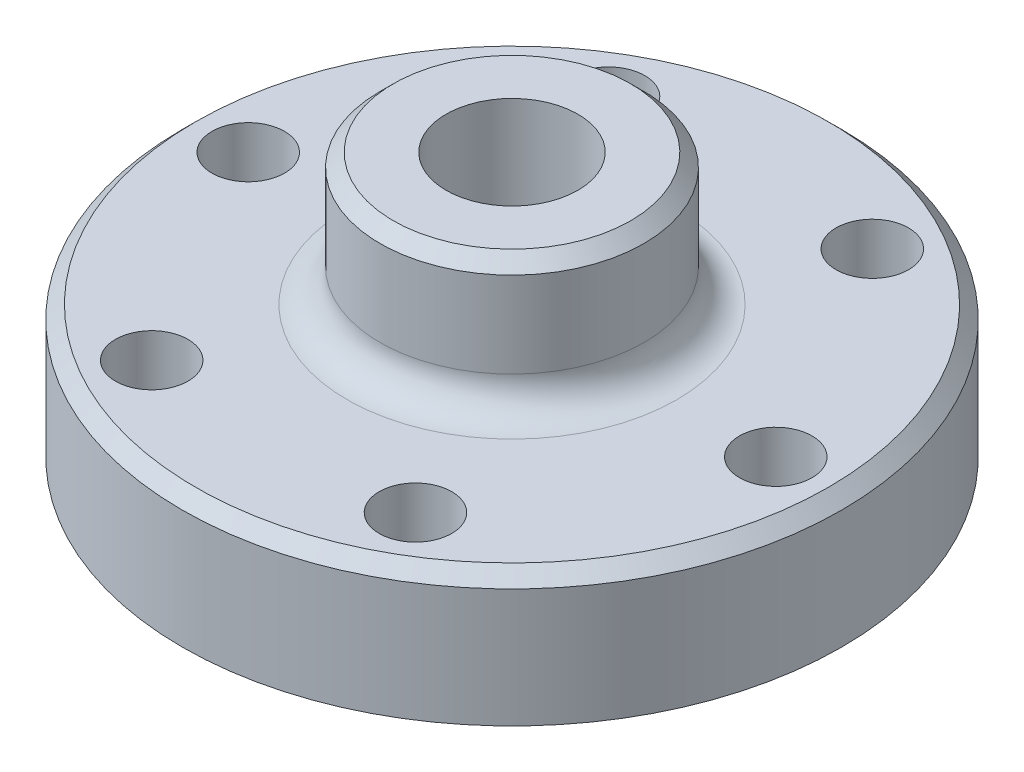
ISO-10303-21;
HEADER;
FILE_DESCRIPTION(('STEP AP214'),'2;1');
FILE_NAME('part.step','',(''),(''),'','','');
FILE_SCHEMA(('AUTOMOTIVE_DESIGN { 1 0 10303 214 1 1 1 1 }'));
ENDSEC;
DATA;
#1=APPLICATION_CONTEXT('core data for automotive mechanical design processes');
#2=APPLICATION_PROTOCOL_DEFINITION('international standard','automotive_design',2000,#1);
#3=PRODUCT_CONTEXT('',#1,'mechanical');
#4=PRODUCT('Part','Part','',(#3));
#5=PRODUCT_RELATED_PRODUCT_CATEGORY('part','',(#4));
#6=PRODUCT_DEFINITION_FORMATION('','',#4);
#7=PRODUCT_DEFINITION_CONTEXT('part definition',#1,'design');
#8=PRODUCT_DEFINITION('design','',#6,#7);
#9=PRODUCT_DEFINITION_SHAPE('','',#8);
#10=(LENGTH_UNIT() NAMED_UNIT(*) SI_UNIT(.MILLI.,.METRE.));
#11=(NAMED_UNIT(*) PLANE_ANGLE_UNIT() SI_UNIT($,.RADIAN.));
#12=(NAMED_UNIT(*) SI_UNIT($,.STERADIAN.) SOLID_ANGLE_UNIT());
#13=UNCERTAINTY_MEASURE_WITH_UNIT(LENGTH_MEASURE(1.E-05),#10,'distance_accuracy_value','');
#14=(GEOMETRIC_REPRESENTATION_CONTEXT(3) GLOBAL_UNCERTAINTY_ASSIGNED_CONTEXT((#13)) GLOBAL_UNIT_ASSIGNED_CONTEXT((#10,
#11,#12)) REPRESENTATION_CONTEXT('',''));
#15=CARTESIAN_POINT('',(0.,0.,0.));
#16=DIRECTION('',(0.,0.,1.));
#17=DIRECTION('',(1.,0.,0.));
#18=AXIS2_PLACEMENT_3D('',#15,#16,#17);
#19=CARTESIAN_POINT('',(2.2007818080183E-12,-641.580774087587,0.));
#20=DIRECTION('',(0.,-1.,0.));
#21=DIRECTION('',(1.,0.,0.));
#22=AXIS2_PLACEMENT_3D('',#19,#20,#21);
#23=CYLINDRICAL_SURFACE('',#22,19.9999999999999);
#24=CARTESIAN_POINT('',(-1.38925084454874E-13,40.5000000000001,0.));
#25=DIRECTION('',(0.,-1.,0.));
#26=DIRECTION('',(1.,0.,0.));
#27=AXIS2_PLACEMENT_3D('',#24,#25,#26);
#28=CIRCLE('',#27,19.9999999999999);
#29=CARTESIAN_POINT('',(19.9999999999997,40.5000000000002,0.));
#30=VERTEX_POINT('',#29);
#31=EDGE_CURVE('E89',#30,#30,#28,.T.);
#32=ORIENTED_EDGE('',*,*,#31,.T.);
#33=EDGE_LOOP('',(#32));
#34=FACE_BOUND('',#33,.T.);
#35=CARTESIAN_POINT('',(0.,27.5000000000002,0.));
#36=DIRECTION('',(0.,-1.,0.));
#37=DIRECTION('',(1.,0.,0.));
#38=AXIS2_PLACEMENT_3D('',#35,#36,#37);
#39=CIRCLE('',#38,19.9999999999999);
#40=CARTESIAN_POINT('',(19.9999999999998,27.5000000000003,0.));
#41=VERTEX_POINT('',#40);
#42=EDGE_CURVE('E93',#41,#41,#39,.T.);
#43=ORIENTED_EDGE('',*,*,#42,.F.);
#44=EDGE_LOOP('',(#43));
#45=FACE_BOUND('',#44,.T.);
#46=ADVANCED_FACE('F45',(#34,#45),#23,.T.);
#47=CARTESIAN_POINT('',(0.,27.5000000000001,0.));
#48=DIRECTION('',(0.,-1.,0.));
#49=DIRECTION('',(1.,0.,0.));
#50=AXIS2_PLACEMENT_3D('',#47,#48,#49);
#51=TOROIDAL_SURFACE('',#50,24.9999999999999,5.);
#52=ORIENTED_EDGE('',*,*,#42,.T.);
#53=EDGE_LOOP('',(#52));
#54=FACE_BOUND('',#53,.T.);
#55=CARTESIAN_POINT('',(0.,22.5000000000001,0.));
#56=DIRECTION('',(0.,-1.,0.));
#57=DIRECTION('',(1.,0.,0.));
#58=AXIS2_PLACEMENT_3D('',#55,#56,#57);
#59=CIRCLE('',#58,25.);
#60=CARTESIAN_POINT('',(24.9999999999999,22.5000000000002,0.));
#61=VERTEX_POINT('',#60);
#62=EDGE_CURVE('E10',#61,#61,#59,.T.);
#63=ORIENTED_EDGE('',*,*,#62,.F.);
#64=EDGE_LOOP('',(#63));
#65=FACE_BOUND('',#64,.T.);
#66=ADVANCED_FACE('F47',(#54,#65),#51,.F.);
#67=CARTESIAN_POINT('',(-1.38925084454874E-13,40.5000000000001,0.));
#68=DIRECTION('',(0.,-1.,0.));
#69=DIRECTION('',(1.,0.,0.));
#70=AXIS2_PLACEMENT_3D('',#67,#68,#69);
#71=CONICAL_SURFACE('',#70,19.9999999999999,0.78539816339745);
#72=CARTESIAN_POINT('',(-1.45785582452645E-13,42.5000000000001,0.));
#73=DIRECTION('',(0.,-1.,0.));
#74=DIRECTION('',(1.,0.,0.));
#75=AXIS2_PLACEMENT_3D('',#72,#73,#74);
#76=CIRCLE('',#75,17.9999999999999);
#77=CARTESIAN_POINT('',(17.9999999999997,42.5000000000002,0.));
#78=VERTEX_POINT('',#77);
#79=EDGE_CURVE('E85',#78,#78,#76,.T.);
#80=ORIENTED_EDGE('',*,*,#79,.T.);
#81=EDGE_LOOP('',(#80));
#82=FACE_BOUND('',#81,.T.);
#83=ORIENTED_EDGE('',*,*,#31,.F.);
#84=EDGE_LOOP('',(#83));
#85=FACE_BOUND('',#84,.T.);
#86=ADVANCED_FACE('F176',(#82,#85),#71,.T.);
#87=CARTESIAN_POINT('',(0.,42.5,0.));
#88=DIRECTION('',(0.,-1.,0.));
#89=DIRECTION('',(1.,0.,0.));
#90=AXIS2_PLACEMENT_3D('',#87,#88,#89);
#91=PLANE('',#90);
#92=ORIENTED_EDGE('',*,*,#79,.F.);
#93=EDGE_LOOP('',(#92));
#94=FACE_BOUND('',#93,.T.);
#95=CARTESIAN_POINT('',(-1.45785582452645E-13,42.5,0.));
#96=DIRECTION('',(0.,-1.,0.));
#97=DIRECTION('',(1.,0.,0.));
#98=AXIS2_PLACEMENT_3D('',#95,#96,#97);
#99=CIRCLE('',#98,9.99999999999985);
#100=CARTESIAN_POINT('',(9.99999999999971,42.5,0.));
#101=VERTEX_POINT('',#100);
#102=EDGE_CURVE('E81',#101,#101,#99,.T.);
#103=ORIENTED_EDGE('',*,*,#102,.T.);
#104=EDGE_LOOP('',(#103));
#105=FACE_BOUND('',#104,.T.);
#106=ADVANCED_FACE('F182',(#94,#105),#91,.F.);
#107=CARTESIAN_POINT('',(2.2007818080183E-12,-641.580774087587,0.));
#108=DIRECTION('',(0.,-1.,0.));
#109=DIRECTION('',(1.,0.,0.));
#110=AXIS2_PLACEMENT_3D('',#107,#108,#109);
#111=CYLINDRICAL_SURFACE('',#110,9.99999999999989);
#112=ORIENTED_EDGE('',*,*,#102,.F.);
#113=EDGE_LOOP('',(#112));
#114=FACE_BOUND('',#113,.T.);
#115=CARTESIAN_POINT('',(0.,0.,0.));
#116=DIRECTION('',(0.,-1.,0.));
#117=DIRECTION('',(1.,0.,0.));
#118=AXIS2_PLACEMENT_3D('',#115,#116,#117);
#119=CIRCLE('',#118,9.99999999999993);
#120=CARTESIAN_POINT('',(9.99999999999993,0.,0.));
#121=VERTEX_POINT('',#120);
#122=EDGE_CURVE('E77',#121,#121,#119,.T.);
#123=ORIENTED_EDGE('',*,*,#122,.T.);
#124=EDGE_LOOP('',(#123));
#125=FACE_BOUND('',#124,.T.);
#126=ADVANCED_FACE('F198',(#114,#125),#111,.F.);
#127=CARTESIAN_POINT('',(0.,0.,0.));
#128=DIRECTION('',(0.,-1.,0.));
#129=DIRECTION('',(1.,0.,0.));
#130=AXIS2_PLACEMENT_3D('',#127,#128,#129);
#131=PLANE('',#130);
#132=CARTESIAN_POINT('',(0.,1.11022302462516E-13,0.));
#133=DIRECTION('',(0.,-1.,0.));
#134=DIRECTION('',(1.,0.,0.));
#135=AXIS2_PLACEMENT_3D('',#132,#133,#134);
#136=CIRCLE('',#135,30.);
#137=CARTESIAN_POINT('',(30.,2.13929772429089E-13,0.));
#138=VERTEX_POINT('',#137);
#139=EDGE_CURVE('E73',#138,#138,#136,.T.);
#140=ORIENTED_EDGE('',*,*,#139,.T.);
#141=EDGE_LOOP('',(#140));
#142=FACE_BOUND('',#141,.T.);
#143=ORIENTED_EDGE('',*,*,#122,.F.);
#144=EDGE_LOOP('',(#143));
#145=FACE_BOUND('',#144,.T.);
#146=ADVANCED_FACE('F202',(#142,#145),#131,.T.);
#147=CARTESIAN_POINT('',(2.2007818080183E-12,-641.580774087587,0.));
#148=DIRECTION('',(0.,-1.,0.));
#149=DIRECTION('',(1.,0.,0.));
#150=AXIS2_PLACEMENT_3D('',#147,#148,#149);
#151=CYLINDRICAL_SURFACE('',#150,30.);
#152=CARTESIAN_POINT('',(0.,2.50000000000017,0.));
#153=DIRECTION('',(0.,-1.,0.));
#154=DIRECTION('',(1.,0.,0.));
#155=AXIS2_PLACEMENT_3D('',#152,#153,#154);
#156=CIRCLE('',#155,30.);
#157=CARTESIAN_POINT('',(30.,2.50000000000027,0.));
#158=VERTEX_POINT('',#157);
#159=EDGE_CURVE('E69',#158,#158,#156,.T.);
#160=ORIENTED_EDGE('',*,*,#159,.T.);
#161=EDGE_LOOP('',(#160));
#162=FACE_BOUND('',#161,.T.);
#163=ORIENTED_EDGE('',*,*,#139,.F.);
#164=EDGE_LOOP('',(#163));
#165=FACE_BOUND('',#164,.T.);
#166=ADVANCED_FACE('F206',(#162,#165),#151,.T.);
#167=CARTESIAN_POINT('',(0.,2.50000000000014,0.));
#168=DIRECTION('',(0.,-1.,0.));
#169=DIRECTION('',(1.,0.,0.));
#170=AXIS2_PLACEMENT_3D('',#167,#168,#169);
#171=PLANE('',#170);
#172=CARTESIAN_POINT('',(-40.,2.5,0.));
#173=DIRECTION('',(0.,-1.,0.));
#174=DIRECTION('',(1.,0.,0.));
#175=AXIS2_PLACEMENT_3D('',#172,#173,#174);
#176=CIRCLE('',#175,5.5);
#177=CARTESIAN_POINT('',(-34.5,2.50000000000002,0.));
#178=VERTEX_POINT('',#177);
#179=EDGE_CURVE('E97',#178,#178,#176,.T.);
#180=ORIENTED_EDGE('',*,*,#179,.F.);
#181=EDGE_LOOP('',(#180));
#182=FACE_BOUND('',#181,.T.);
#183=CARTESIAN_POINT('',(-20.,2.50000000000007,34.6410161513775));
#184=DIRECTION('',(0.,-1.,0.));
#185=DIRECTION('',(1.,0.,0.));
#186=AXIS2_PLACEMENT_3D('',#183,#184,#185);
#187=CIRCLE('',#186,5.5);
#188=CARTESIAN_POINT('',(-14.5,2.50000000000009,34.6410161513775));
#189=VERTEX_POINT('',#188);
#190=EDGE_CURVE('E101',#189,#189,#187,.T.);
#191=ORIENTED_EDGE('',*,*,#190,.F.);
#192=EDGE_LOOP('',(#191));
#193=FACE_BOUND('',#192,.T.);
#194=CARTESIAN_POINT('',(20.,2.50000000000021,34.6410161513775));
#195=DIRECTION('',(0.,-1.,0.));
#196=DIRECTION('',(1.,0.,0.));
#197=AXIS2_PLACEMENT_3D('',#194,#195,#196);
#198=CIRCLE('',#197,5.5);
#199=CARTESIAN_POINT('',(25.5,2.50000000000023,34.6410161513775));
#200=VERTEX_POINT('',#199);
#201=EDGE_CURVE('E105',#200,#200,#198,.T.);
#202=ORIENTED_EDGE('',*,*,#201,.F.);
#203=EDGE_LOOP('',(#202));
#204=FACE_BOUND('',#203,.T.);
#205=CARTESIAN_POINT('',(40.,2.50000000000028,0.));
#206=DIRECTION('',(0.,-1.,0.));
#207=DIRECTION('',(1.,0.,0.));
#208=AXIS2_PLACEMENT_3D('',#205,#206,#207);
#209=CIRCLE('',#208,5.5);
#210=CARTESIAN_POINT('',(45.5,2.5000000000003,0.));
#211=VERTEX_POINT('',#210);
#212=EDGE_CURVE('E109',#211,#211,#209,.T.);
#213=ORIENTED_EDGE('',*,*,#212,.F.);
#214=EDGE_LOOP('',(#213));
#215=FACE_BOUND('',#214,.T.);
#216=CARTESIAN_POINT('',(20.,2.50000000000021,-34.6410161513776));
#217=DIRECTION('',(0.,-1.,0.));
#218=DIRECTION('',(1.,0.,0.));
#219=AXIS2_PLACEMENT_3D('',#216,#217,#218);
#220=CIRCLE('',#219,5.5);
#221=CARTESIAN_POINT('',(25.5,2.50000000000023,-34.6410161513776));
#222=VERTEX_POINT('',#221);
#223=EDGE_CURVE('E113',#222,#222,#220,.T.);
#224=ORIENTED_EDGE('',*,*,#223,.F.);
#225=EDGE_LOOP('',(#224));
#226=FACE_BOUND('',#225,.T.);
#227=CARTESIAN_POINT('',(-20.,2.50000000000007,-34.6410161513775));
#228=DIRECTION('',(0.,-1.,0.));
#229=DIRECTION('',(1.,0.,0.));
#230=AXIS2_PLACEMENT_3D('',#227,#228,#229);
#231=CIRCLE('',#230,5.5);
#232=CARTESIAN_POINT('',(-14.5,2.50000000000009,-34.6410161513775));
#233=VERTEX_POINT('',#232);
#234=EDGE_CURVE('E117',#233,#233,#231,.T.);
#235=ORIENTED_EDGE('',*,*,#234,.F.);
#236=EDGE_LOOP('',(#235));
#237=FACE_BOUND('',#236,.T.);
#238=CARTESIAN_POINT('',(0.,2.50000000000028,0.));
#239=DIRECTION('',(0.,-1.,0.));
#240=DIRECTION('',(1.,0.,0.));
#241=AXIS2_PLACEMENT_3D('',#238,#239,#240);
#242=CIRCLE('',#241,50.);
#243=CARTESIAN_POINT('',(50.,2.50000000000045,0.));
#244=VERTEX_POINT('',#243);
#245=EDGE_CURVE('E63',#244,#244,#242,.T.);
#246=ORIENTED_EDGE('',*,*,#245,.T.);
#247=EDGE_LOOP('',(#246));
#248=FACE_BOUND('',#247,.T.);
#249=ORIENTED_EDGE('',*,*,#159,.F.);
#250=EDGE_LOOP('',(#249));
#251=FACE_BOUND('',#250,.T.);
#252=ADVANCED_FACE('F210',(#182,#193,#204,#215,#226,#237,#248,#251),#171,.T.);
#253=CARTESIAN_POINT('',(2.2007818080183E-12,-641.580774087587,0.));
#254=DIRECTION('',(0.,-1.,0.));
#255=DIRECTION('',(1.,0.,0.));
#256=AXIS2_PLACEMENT_3D('',#253,#254,#255);
#257=CYLINDRICAL_SURFACE('',#256,50.);
#258=CARTESIAN_POINT('',(0.,20.5000000000002,0.));
#259=DIRECTION('',(0.,-1.,0.));
#260=DIRECTION('',(1.,0.,0.));
#261=AXIS2_PLACEMENT_3D('',#258,#259,#260);
#262=CIRCLE('',#261,49.9999999999999);
#263=CARTESIAN_POINT('',(49.9999999999999,20.5000000000004,0.));
#264=VERTEX_POINT('',#263);
#265=EDGE_CURVE('E58',#264,#264,#262,.T.);
#266=ORIENTED_EDGE('',*,*,#265,.T.);
#267=EDGE_LOOP('',(#266));
#268=FACE_BOUND('',#267,.T.);
#269=ORIENTED_EDGE('',*,*,#245,.F.);
#270=EDGE_LOOP('',(#269));
#271=FACE_BOUND('',#270,.T.);
#272=ADVANCED_FACE('F214',(#268,#271),#257,.T.);
#273=CARTESIAN_POINT('',(0.,20.5000000000002,0.));
#274=DIRECTION('',(0.,-1.,0.));
#275=DIRECTION('',(1.,0.,0.));
#276=AXIS2_PLACEMENT_3D('',#273,#274,#275);
#277=CONICAL_SURFACE('',#276,49.9999999999999,0.785398163397478);
#278=CARTESIAN_POINT('',(0.,22.5000000000001,0.));
#279=DIRECTION('',(0.,-1.,0.));
#280=DIRECTION('',(1.,0.,0.));
#281=AXIS2_PLACEMENT_3D('',#278,#279,#280);
#282=CIRCLE('',#281,47.9999999999999);
#283=CARTESIAN_POINT('',(47.9999999999999,22.5000000000002,0.));
#284=VERTEX_POINT('',#283);
#285=EDGE_CURVE('E53',#284,#284,#282,.T.);
#286=ORIENTED_EDGE('',*,*,#285,.T.);
#287=EDGE_LOOP('',(#286));
#288=FACE_BOUND('',#287,.T.);
#289=ORIENTED_EDGE('',*,*,#265,.F.);
#290=EDGE_LOOP('',(#289));
#291=FACE_BOUND('',#290,.T.);
#292=ADVANCED_FACE('F152',(#288,#291),#277,.T.);
#293=CARTESIAN_POINT('',(0.,22.5000000000001,0.));
#294=DIRECTION('',(0.,1.,0.));
#295=DIRECTION('',(-1.,0.,0.));
#296=AXIS2_PLACEMENT_3D('',#293,#294,#295);
#297=PLANE('',#296);
#298=CARTESIAN_POINT('',(-40.0000000000001,22.5,0.));
#299=DIRECTION('',(0.,1.,0.));
#300=DIRECTION('',(-1.,0.,0.));
#301=AXIS2_PLACEMENT_3D('',#298,#299,#300);
#302=CIRCLE('',#301,5.5);
#303=CARTESIAN_POINT('',(-45.5000000000001,22.5,0.));
#304=VERTEX_POINT('',#303);
#305=EDGE_CURVE('E121',#304,#304,#302,.T.);
#306=ORIENTED_EDGE('',*,*,#305,.F.);
#307=EDGE_LOOP('',(#306));
#308=FACE_BOUND('',#307,.T.);
#309=CARTESIAN_POINT('',(-20.0000000000001,22.5000000000001,34.6410161513775));
#310=DIRECTION('',(0.,1.,0.));
#311=DIRECTION('',(-1.,0.,0.));
#312=AXIS2_PLACEMENT_3D('',#309,#310,#311);
#313=CIRCLE('',#312,5.5);
#314=CARTESIAN_POINT('',(-25.5000000000001,22.5,34.6410161513775));
#315=VERTEX_POINT('',#314);
#316=EDGE_CURVE('E127',#315,#315,#313,.T.);
#317=ORIENTED_EDGE('',*,*,#316,.F.);
#318=EDGE_LOOP('',(#317));
#319=FACE_BOUND('',#318,.T.);
#320=CARTESIAN_POINT('',(19.9999999999999,22.5000000000002,34.6410161513775));
#321=DIRECTION('',(0.,1.,0.));
#322=DIRECTION('',(-1.,0.,0.));
#323=AXIS2_PLACEMENT_3D('',#320,#321,#322);
#324=CIRCLE('',#323,5.5);
#325=CARTESIAN_POINT('',(14.4999999999999,22.5000000000002,34.6410161513775));
#326=VERTEX_POINT('',#325);
#327=EDGE_CURVE('E122',#326,#326,#324,.T.);
#328=ORIENTED_EDGE('',*,*,#327,.F.);
#329=EDGE_LOOP('',(#328));
#330=FACE_BOUND('',#329,.T.);
#331=CARTESIAN_POINT('',(39.9999999999999,22.5000000000003,0.));
#332=DIRECTION('',(0.,1.,0.));
#333=DIRECTION('',(-1.,0.,0.));
#334=AXIS2_PLACEMENT_3D('',#331,#332,#333);
#335=CIRCLE('',#334,5.5);
#336=CARTESIAN_POINT('',(34.4999999999999,22.5000000000002,0.));
#337=VERTEX_POINT('',#336);
#338=EDGE_CURVE('E126',#337,#337,#335,.T.);
#339=ORIENTED_EDGE('',*,*,#338,.F.);
#340=EDGE_LOOP('',(#339));
#341=FACE_BOUND('',#340,.T.);
#342=CARTESIAN_POINT('',(19.9999999999999,22.5000000000002,-34.6410161513776));
#343=DIRECTION('',(0.,1.,0.));
#344=DIRECTION('',(-1.,0.,0.));
#345=AXIS2_PLACEMENT_3D('',#342,#343,#344);
#346=CIRCLE('',#345,5.5);
#347=CARTESIAN_POINT('',(14.4999999999999,22.5000000000002,-34.6410161513776));
#348=VERTEX_POINT('',#347);
#349=EDGE_CURVE('E131',#348,#348,#346,.T.);
#350=ORIENTED_EDGE('',*,*,#349,.F.);
#351=EDGE_LOOP('',(#350));
#352=FACE_BOUND('',#351,.T.);
#353=CARTESIAN_POINT('',(-20.0000000000001,22.5000000000001,-34.6410161513775));
#354=DIRECTION('',(0.,1.,0.));
#355=DIRECTION('',(-1.,0.,0.));
#356=AXIS2_PLACEMENT_3D('',#353,#354,#355);
#357=CIRCLE('',#356,5.5);
#358=CARTESIAN_POINT('',(-25.5000000000001,22.5,-34.6410161513775));
#359=VERTEX_POINT('',#358);
#360=EDGE_CURVE('E135',#359,#359,#357,.T.);
#361=ORIENTED_EDGE('',*,*,#360,.F.);
#362=EDGE_LOOP('',(#361));
#363=FACE_BOUND('',#362,.T.);
#364=ORIENTED_EDGE('',*,*,#62,.T.);
#365=EDGE_LOOP('',(#364));
#366=FACE_BOUND('',#365,.T.);
#367=ORIENTED_EDGE('',*,*,#285,.F.);
#368=EDGE_LOOP('',(#367));
#369=FACE_BOUND('',#368,.T.);
#370=ADVANCED_FACE('F148',(#308,#319,#330,#341,#352,#363,#366,#369),#297,.T.);
#371=CARTESIAN_POINT('',(-20.,-2.04697370165263E-13,-34.6410161513775));
#372=DIRECTION('',(0.,1.,0.));
#373=DIRECTION('',(-1.,0.,0.));
#374=AXIS2_PLACEMENT_3D('',#371,#372,#373);
#375=CYLINDRICAL_SURFACE('',#374,5.5);
#376=ORIENTED_EDGE('',*,*,#234,.T.);
#377=EDGE_LOOP('',(#376));
#378=FACE_BOUND('',#377,.T.);
#379=ORIENTED_EDGE('',*,*,#360,.T.);
#380=EDGE_LOOP('',(#379));
#381=FACE_BOUND('',#380,.T.);
#382=ADVANCED_FACE('F151',(#378,#381),#375,.F.);
#383=CARTESIAN_POINT('',(20.,0.,-34.6410161513776));
#384=DIRECTION('',(0.,1.,0.));
#385=DIRECTION('',(-1.,0.,0.));
#386=AXIS2_PLACEMENT_3D('',#383,#384,#385);
#387=CYLINDRICAL_SURFACE('',#386,5.5);
#388=ORIENTED_EDGE('',*,*,#223,.T.);
#389=EDGE_LOOP('',(#388));
#390=FACE_BOUND('',#389,.T.);
#391=ORIENTED_EDGE('',*,*,#349,.T.);
#392=EDGE_LOOP('',(#391));
#393=FACE_BOUND('',#392,.T.);
#394=ADVANCED_FACE('F165',(#390,#393),#387,.F.);
#395=CARTESIAN_POINT('',(40.,0.,0.));
#396=DIRECTION('',(0.,1.,0.));
#397=DIRECTION('',(-1.,0.,0.));
#398=AXIS2_PLACEMENT_3D('',#395,#396,#397);
#399=CYLINDRICAL_SURFACE('',#398,5.5);
#400=ORIENTED_EDGE('',*,*,#212,.T.);
#401=EDGE_LOOP('',(#400));
#402=FACE_BOUND('',#401,.T.);
#403=ORIENTED_EDGE('',*,*,#338,.T.);
#404=EDGE_LOOP('',(#403));
#405=FACE_BOUND('',#404,.T.);
#406=ADVANCED_FACE('F171',(#402,#405),#399,.F.);
#407=CARTESIAN_POINT('',(20.,0.,34.6410161513775));
#408=DIRECTION('',(0.,1.,0.));
#409=DIRECTION('',(-1.,0.,0.));
#410=AXIS2_PLACEMENT_3D('',#407,#408,#409);
#411=CYLINDRICAL_SURFACE('',#410,5.5);
#412=ORIENTED_EDGE('',*,*,#201,.T.);
#413=EDGE_LOOP('',(#412));
#414=FACE_BOUND('',#413,.T.);
#415=ORIENTED_EDGE('',*,*,#327,.T.);
#416=EDGE_LOOP('',(#415));
#417=FACE_BOUND('',#416,.T.);
#418=ADVANCED_FACE('F193',(#414,#417),#411,.F.);
#419=CARTESIAN_POINT('',(-20.,-2.04697370165263E-13,34.6410161513775));
#420=DIRECTION('',(0.,1.,0.));
#421=DIRECTION('',(-1.,0.,0.));
#422=AXIS2_PLACEMENT_3D('',#419,#420,#421);
#423=CYLINDRICAL_SURFACE('',#422,5.5);
#424=ORIENTED_EDGE('',*,*,#190,.T.);
#425=EDGE_LOOP('',(#424));
#426=FACE_BOUND('',#425,.T.);
#427=ORIENTED_EDGE('',*,*,#316,.T.);
#428=EDGE_LOOP('',(#427));
#429=FACE_BOUND('',#428,.T.);
#430=ADVANCED_FACE('F277',(#426,#429),#423,.F.);
#431=CARTESIAN_POINT('',(-40.,-2.74086309204336E-13,0.));
#432=DIRECTION('',(0.,1.,0.));
#433=DIRECTION('',(-1.,0.,0.));
#434=AXIS2_PLACEMENT_3D('',#431,#432,#433);
#435=CYLINDRICAL_SURFACE('',#434,5.5);
#436=ORIENTED_EDGE('',*,*,#179,.T.);
#437=EDGE_LOOP('',(#436));
#438=FACE_BOUND('',#437,.T.);
#439=ORIENTED_EDGE('',*,*,#305,.T.);
#440=EDGE_LOOP('',(#439));
#441=FACE_BOUND('',#440,.T.);
#442=ADVANCED_FACE('F146',(#438,#441),#435,.F.);
#443=CLOSED_SHELL('',(#46,#66,#86,#106,#126,#146,#166,#252,#272,#292,#370,#382,#394,#406,#418,
#430,#442));
#444=MANIFOLD_SOLID_BREP('B2',#443);
#445=ADVANCED_BREP_SHAPE_REPRESENTATION('',(#18,#444),#14);
#446=SHAPE_DEFINITION_REPRESENTATION(#9,#445);
ENDSEC;
END-ISO-10303-21;
